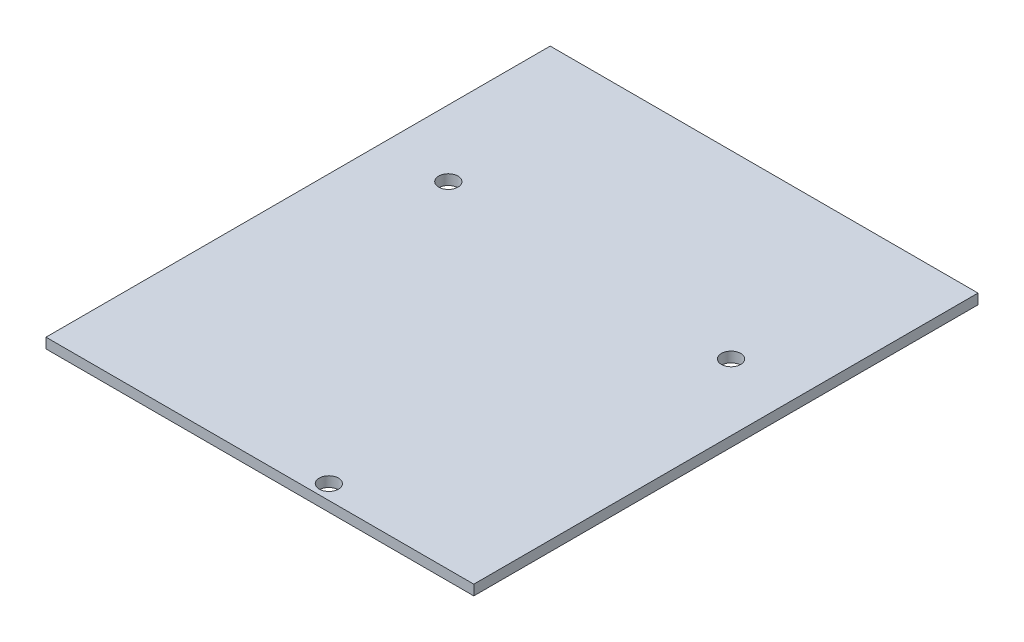
ISO-10303-21;
HEADER;
FILE_DESCRIPTION(('STEP AP214'),'2;1');
FILE_NAME('part.step','',(''),(''),'','','');
FILE_SCHEMA(('AUTOMOTIVE_DESIGN { 1 0 10303 214 1 1 1 1 }'));
ENDSEC;
DATA;
#1=APPLICATION_CONTEXT('core data for automotive mechanical design processes');
#2=APPLICATION_PROTOCOL_DEFINITION('international standard','automotive_design',2000,#1);
#3=PRODUCT_CONTEXT('',#1,'mechanical');
#4=PRODUCT('Part','Part','',(#3));
#5=PRODUCT_RELATED_PRODUCT_CATEGORY('part','',(#4));
#6=PRODUCT_DEFINITION_FORMATION('','',#4);
#7=PRODUCT_DEFINITION_CONTEXT('part definition',#1,'design');
#8=PRODUCT_DEFINITION('design','',#6,#7);
#9=PRODUCT_DEFINITION_SHAPE('','',#8);
#10=(LENGTH_UNIT() NAMED_UNIT(*) SI_UNIT(.MILLI.,.METRE.));
#11=(NAMED_UNIT(*) PLANE_ANGLE_UNIT() SI_UNIT($,.RADIAN.));
#12=(NAMED_UNIT(*) SI_UNIT($,.STERADIAN.) SOLID_ANGLE_UNIT());
#13=UNCERTAINTY_MEASURE_WITH_UNIT(LENGTH_MEASURE(1.E-05),#10,'distance_accuracy_value','');
#14=(GEOMETRIC_REPRESENTATION_CONTEXT(3) GLOBAL_UNCERTAINTY_ASSIGNED_CONTEXT((#13)) GLOBAL_UNIT_ASSIGNED_CONTEXT((#10,
#11,#12)) REPRESENTATION_CONTEXT('',''));
#15=CARTESIAN_POINT('',(0.,0.,0.));
#16=DIRECTION('',(0.,0.,1.));
#17=DIRECTION('',(1.,0.,0.));
#18=AXIS2_PLACEMENT_3D('',#15,#16,#17);
#19=CARTESIAN_POINT('',(0.,1.67,0.));
#20=DIRECTION('',(0.,1.,0.));
#21=DIRECTION('',(0.,0.,1.));
#22=AXIS2_PLACEMENT_3D('',#19,#20,#21);
#23=PLANE('',#22);
#24=CARTESIAN_POINT('',(-19.8844378698225,1.67,-5.80319526627218));
#25=DIRECTION('',(0.,1.,0.));
#26=DIRECTION('',(0.,0.,1.));
#27=AXIS2_PLACEMENT_3D('',#24,#25,#26);
#28=CIRCLE('',#27,1.575);
#29=CARTESIAN_POINT('',(-19.8844378698225,1.67,-4.22819526627218));
#30=VERTEX_POINT('',#29);
#31=EDGE_CURVE('E114',#30,#30,#28,.T.);
#32=ORIENTED_EDGE('',*,*,#31,.F.);
#33=EDGE_LOOP('',(#32));
#34=FACE_BOUND('',#33,.T.);
#35=DIRECTION('',(0.,0.,1.));
#36=VECTOR('',#35,1.);
#37=CARTESIAN_POINT('',(-30.7544378698225,1.67,-33.3431952662722));
#38=LINE('',#37,#36);
#39=CARTESIAN_POINT('',(-30.7544378698225,1.67,-33.3431952662722));
#40=VERTEX_POINT('',#39);
#41=CARTESIAN_POINT('',(-30.7544378698225,1.67,49.1568047337278));
#42=VERTEX_POINT('',#41);
#43=EDGE_CURVE('E84',#40,#42,#38,.T.);
#44=ORIENTED_EDGE('',*,*,#43,.T.);
#45=DIRECTION('',(1.,0.,0.));
#46=VECTOR('',#45,1.);
#47=CARTESIAN_POINT('',(-30.7544378698225,1.67,49.1568047337278));
#48=LINE('',#47,#46);
#49=CARTESIAN_POINT('',(39.2455621301775,1.67,49.1568047337278));
#50=VERTEX_POINT('',#49);
#51=EDGE_CURVE('E79',#42,#50,#48,.T.);
#52=ORIENTED_EDGE('',*,*,#51,.T.);
#53=DIRECTION('',(0.,0.,-1.));
#54=VECTOR('',#53,1.);
#55=CARTESIAN_POINT('',(39.2455621301775,1.67,-33.3431952662722));
#56=LINE('',#55,#54);
#57=CARTESIAN_POINT('',(39.2455621301775,1.67,-33.3431952662722));
#58=VERTEX_POINT('',#57);
#59=EDGE_CURVE('E82',#50,#58,#56,.T.);
#60=ORIENTED_EDGE('',*,*,#59,.T.);
#61=DIRECTION('',(-1.,0.,0.));
#62=VECTOR('',#61,1.);
#63=CARTESIAN_POINT('',(-30.7544378698225,1.67,-33.3431952662722));
#64=LINE('',#63,#62);
#65=EDGE_CURVE('E49',#58,#40,#64,.T.);
#66=ORIENTED_EDGE('',*,*,#65,.T.);
#67=EDGE_LOOP('',(#44,#52,#60,#66));
#68=FACE_BOUND('',#67,.T.);
#69=CARTESIAN_POINT('',(13.1355621301775,1.67,46.7668047337278));
#70=DIRECTION('',(0.,1.,0.));
#71=DIRECTION('',(0.,0.,1.));
#72=AXIS2_PLACEMENT_3D('',#69,#70,#71);
#73=CIRCLE('',#72,1.575);
#74=CARTESIAN_POINT('',(13.1355621301775,1.67,48.3418047337278));
#75=VERTEX_POINT('',#74);
#76=EDGE_CURVE('E99',#75,#75,#73,.T.);
#77=ORIENTED_EDGE('',*,*,#76,.F.);
#78=EDGE_LOOP('',(#77));
#79=FACE_BOUND('',#78,.T.);
#80=CARTESIAN_POINT('',(28.3755621301775,1.67,-3.80319526627218));
#81=DIRECTION('',(0.,1.,0.));
#82=DIRECTION('',(0.,0.,1.));
#83=AXIS2_PLACEMENT_3D('',#80,#81,#82);
#84=CIRCLE('',#83,1.575);
#85=CARTESIAN_POINT('',(28.3755621301775,1.67,-2.22819526627218));
#86=VERTEX_POINT('',#85);
#87=EDGE_CURVE('E120',#86,#86,#84,.T.);
#88=ORIENTED_EDGE('',*,*,#87,.F.);
#89=EDGE_LOOP('',(#88));
#90=FACE_BOUND('',#89,.T.);
#91=ADVANCED_FACE('F32',(#34,#68,#79,#90),#23,.T.);
#92=CARTESIAN_POINT('',(0.,0.,0.));
#93=DIRECTION('',(0.,1.,0.));
#94=DIRECTION('',(0.,0.,1.));
#95=AXIS2_PLACEMENT_3D('',#92,#93,#94);
#96=PLANE('',#95);
#97=DIRECTION('',(0.,0.,1.));
#98=VECTOR('',#97,1.);
#99=CARTESIAN_POINT('',(-30.7544378698225,0.,-33.3431952662722));
#100=LINE('',#99,#98);
#101=CARTESIAN_POINT('',(-30.7544378698225,0.,-33.3431952662722));
#102=VERTEX_POINT('',#101);
#103=CARTESIAN_POINT('',(-30.7544378698225,0.,49.1568047337278));
#104=VERTEX_POINT('',#103);
#105=EDGE_CURVE('E96',#102,#104,#100,.T.);
#106=ORIENTED_EDGE('',*,*,#105,.F.);
#107=DIRECTION('',(-1.,0.,0.));
#108=VECTOR('',#107,1.);
#109=CARTESIAN_POINT('',(-30.7544378698225,0.,-33.3431952662722));
#110=LINE('',#109,#108);
#111=CARTESIAN_POINT('',(39.2455621301775,0.,-33.3431952662722));
#112=VERTEX_POINT('',#111);
#113=EDGE_CURVE('E72',#112,#102,#110,.T.);
#114=ORIENTED_EDGE('',*,*,#113,.F.);
#115=DIRECTION('',(0.,0.,-1.));
#116=VECTOR('',#115,1.);
#117=CARTESIAN_POINT('',(39.2455621301775,0.,-33.3431952662722));
#118=LINE('',#117,#116);
#119=CARTESIAN_POINT('',(39.2455621301775,0.,49.1568047337278));
#120=VERTEX_POINT('',#119);
#121=EDGE_CURVE('E66',#120,#112,#118,.T.);
#122=ORIENTED_EDGE('',*,*,#121,.F.);
#123=DIRECTION('',(1.,0.,0.));
#124=VECTOR('',#123,1.);
#125=CARTESIAN_POINT('',(-30.7544378698225,0.,49.1568047337278));
#126=LINE('',#125,#124);
#127=EDGE_CURVE('E88',#104,#120,#126,.T.);
#128=ORIENTED_EDGE('',*,*,#127,.F.);
#129=EDGE_LOOP('',(#106,#114,#122,#128));
#130=FACE_BOUND('',#129,.T.);
#131=CARTESIAN_POINT('',(13.1355621301775,0.,46.7668047337278));
#132=DIRECTION('',(0.,1.,0.));
#133=DIRECTION('',(0.,0.,1.));
#134=AXIS2_PLACEMENT_3D('',#131,#132,#133);
#135=CIRCLE('',#134,1.575);
#136=CARTESIAN_POINT('',(13.1355621301775,0.,48.3418047337278));
#137=VERTEX_POINT('',#136);
#138=EDGE_CURVE('E111',#137,#137,#135,.T.);
#139=ORIENTED_EDGE('',*,*,#138,.T.);
#140=EDGE_LOOP('',(#139));
#141=FACE_BOUND('',#140,.T.);
#142=CARTESIAN_POINT('',(-19.8844378698225,0.,-5.80319526627218));
#143=DIRECTION('',(0.,1.,0.));
#144=DIRECTION('',(0.,0.,1.));
#145=AXIS2_PLACEMENT_3D('',#142,#143,#144);
#146=CIRCLE('',#145,1.575);
#147=CARTESIAN_POINT('',(-19.8844378698225,0.,-4.22819526627218));
#148=VERTEX_POINT('',#147);
#149=EDGE_CURVE('E117',#148,#148,#146,.T.);
#150=ORIENTED_EDGE('',*,*,#149,.T.);
#151=EDGE_LOOP('',(#150));
#152=FACE_BOUND('',#151,.T.);
#153=CARTESIAN_POINT('',(28.3755621301775,0.,-3.80319526627218));
#154=DIRECTION('',(0.,1.,0.));
#155=DIRECTION('',(0.,0.,1.));
#156=AXIS2_PLACEMENT_3D('',#153,#154,#155);
#157=CIRCLE('',#156,1.575);
#158=CARTESIAN_POINT('',(28.3755621301775,0.,-2.22819526627218));
#159=VERTEX_POINT('',#158);
#160=EDGE_CURVE('E123',#159,#159,#157,.T.);
#161=ORIENTED_EDGE('',*,*,#160,.T.);
#162=EDGE_LOOP('',(#161));
#163=FACE_BOUND('',#162,.T.);
#164=ADVANCED_FACE('F107',(#130,#141,#152,#163),#96,.F.);
#165=CARTESIAN_POINT('',(-30.7544378698225,1.67,-33.3431952662722));
#166=DIRECTION('',(1.,0.,0.));
#167=DIRECTION('',(0.,0.,-1.));
#168=AXIS2_PLACEMENT_3D('',#165,#166,#167);
#169=PLANE('',#168);
#170=ORIENTED_EDGE('',*,*,#105,.T.);
#171=DIRECTION('',(0.,-1.,0.));
#172=VECTOR('',#171,1.);
#173=CARTESIAN_POINT('',(-30.7544378698225,1.67,49.1568047337278));
#174=LINE('',#173,#172);
#175=EDGE_CURVE('E11',#42,#104,#174,.T.);
#176=ORIENTED_EDGE('',*,*,#175,.F.);
#177=ORIENTED_EDGE('',*,*,#43,.F.);
#178=DIRECTION('',(0.,-1.,0.));
#179=VECTOR('',#178,1.);
#180=CARTESIAN_POINT('',(-30.7544378698225,1.67,-33.3431952662722));
#181=LINE('',#180,#179);
#182=EDGE_CURVE('E92',#40,#102,#181,.T.);
#183=ORIENTED_EDGE('',*,*,#182,.T.);
#184=EDGE_LOOP('',(#170,#176,#177,#183));
#185=FACE_BOUND('',#184,.T.);
#186=ADVANCED_FACE('F34',(#185),#169,.F.);
#187=CARTESIAN_POINT('',(-30.7544378698225,1.67,49.1568047337278));
#188=DIRECTION('',(0.,0.,-1.));
#189=DIRECTION('',(-1.,0.,0.));
#190=AXIS2_PLACEMENT_3D('',#187,#188,#189);
#191=PLANE('',#190);
#192=ORIENTED_EDGE('',*,*,#127,.T.);
#193=DIRECTION('',(0.,-1.,0.));
#194=VECTOR('',#193,1.);
#195=CARTESIAN_POINT('',(39.2455621301775,1.67,49.1568047337278));
#196=LINE('',#195,#194);
#197=EDGE_CURVE('E41',#50,#120,#196,.T.);
#198=ORIENTED_EDGE('',*,*,#197,.F.);
#199=ORIENTED_EDGE('',*,*,#51,.F.);
#200=ORIENTED_EDGE('',*,*,#175,.T.);
#201=EDGE_LOOP('',(#192,#198,#199,#200));
#202=FACE_BOUND('',#201,.T.);
#203=ADVANCED_FACE('F87',(#202),#191,.F.);
#204=CARTESIAN_POINT('',(39.2455621301775,1.67,-33.3431952662722));
#205=DIRECTION('',(-1.,0.,0.));
#206=DIRECTION('',(0.,0.,1.));
#207=AXIS2_PLACEMENT_3D('',#204,#205,#206);
#208=PLANE('',#207);
#209=ORIENTED_EDGE('',*,*,#121,.T.);
#210=DIRECTION('',(0.,-1.,0.));
#211=VECTOR('',#210,1.);
#212=CARTESIAN_POINT('',(39.2455621301775,1.67,-33.3431952662722));
#213=LINE('',#212,#211);
#214=EDGE_CURVE('E89',#58,#112,#213,.T.);
#215=ORIENTED_EDGE('',*,*,#214,.F.);
#216=ORIENTED_EDGE('',*,*,#59,.F.);
#217=ORIENTED_EDGE('',*,*,#197,.T.);
#218=EDGE_LOOP('',(#209,#215,#216,#217));
#219=FACE_BOUND('',#218,.T.);
#220=ADVANCED_FACE('F90',(#219),#208,.F.);
#221=CARTESIAN_POINT('',(-30.7544378698225,1.67,-33.3431952662722));
#222=DIRECTION('',(0.,0.,1.));
#223=DIRECTION('',(1.,0.,0.));
#224=AXIS2_PLACEMENT_3D('',#221,#222,#223);
#225=PLANE('',#224);
#226=ORIENTED_EDGE('',*,*,#113,.T.);
#227=ORIENTED_EDGE('',*,*,#182,.F.);
#228=ORIENTED_EDGE('',*,*,#65,.F.);
#229=ORIENTED_EDGE('',*,*,#214,.T.);
#230=EDGE_LOOP('',(#226,#227,#228,#229));
#231=FACE_BOUND('',#230,.T.);
#232=ADVANCED_FACE('F104',(#231),#225,.F.);
#233=CARTESIAN_POINT('',(13.1355621301775,1.67,46.7668047337278));
#234=DIRECTION('',(0.,-1.,0.));
#235=DIRECTION('',(0.,0.,-1.));
#236=AXIS2_PLACEMENT_3D('',#233,#234,#235);
#237=CYLINDRICAL_SURFACE('',#236,1.575);
#238=ORIENTED_EDGE('',*,*,#76,.T.);
#239=EDGE_LOOP('',(#238));
#240=FACE_BOUND('',#239,.T.);
#241=ORIENTED_EDGE('',*,*,#138,.F.);
#242=EDGE_LOOP('',(#241));
#243=FACE_BOUND('',#242,.T.);
#244=ADVANCED_FACE('F141',(#240,#243),#237,.F.);
#245=CARTESIAN_POINT('',(-19.8844378698225,1.67,-5.80319526627218));
#246=DIRECTION('',(0.,-1.,0.));
#247=DIRECTION('',(0.,0.,-1.));
#248=AXIS2_PLACEMENT_3D('',#245,#246,#247);
#249=CYLINDRICAL_SURFACE('',#248,1.575);
#250=ORIENTED_EDGE('',*,*,#31,.T.);
#251=EDGE_LOOP('',(#250));
#252=FACE_BOUND('',#251,.T.);
#253=ORIENTED_EDGE('',*,*,#149,.F.);
#254=EDGE_LOOP('',(#253));
#255=FACE_BOUND('',#254,.T.);
#256=ADVANCED_FACE('F187',(#252,#255),#249,.F.);
#257=CARTESIAN_POINT('',(28.3755621301775,1.67,-3.80319526627218));
#258=DIRECTION('',(0.,-1.,0.));
#259=DIRECTION('',(0.,0.,-1.));
#260=AXIS2_PLACEMENT_3D('',#257,#258,#259);
#261=CYLINDRICAL_SURFACE('',#260,1.575);
#262=ORIENTED_EDGE('',*,*,#87,.T.);
#263=EDGE_LOOP('',(#262));
#264=FACE_BOUND('',#263,.T.);
#265=ORIENTED_EDGE('',*,*,#160,.F.);
#266=EDGE_LOOP('',(#265));
#267=FACE_BOUND('',#266,.T.);
#268=ADVANCED_FACE('F129',(#264,#267),#261,.F.);
#269=CLOSED_SHELL('',(#91,#164,#186,#203,#220,#232,#244,#256,#268));
#270=MANIFOLD_SOLID_BREP('B2',#269);
#271=ADVANCED_BREP_SHAPE_REPRESENTATION('',(#18,#270),#14);
#272=SHAPE_DEFINITION_REPRESENTATION(#9,#271);
ENDSEC;
END-ISO-10303-21;
